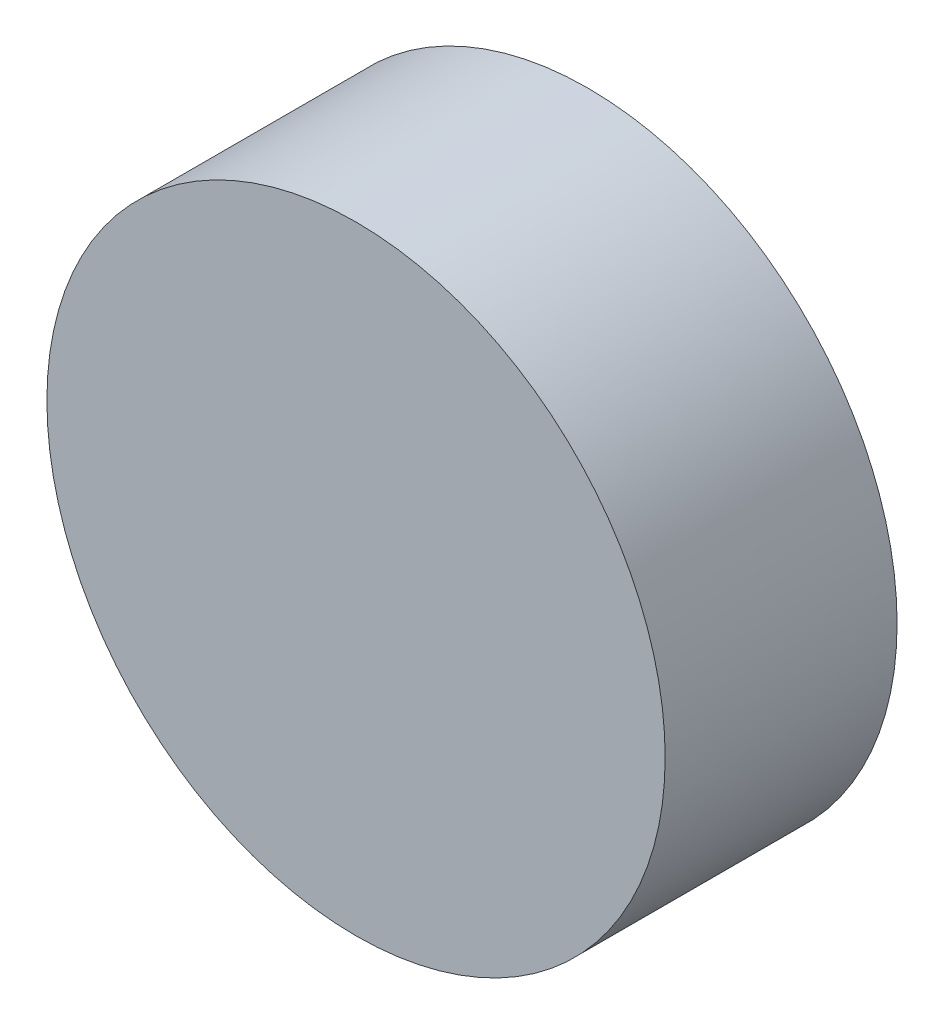
ISO-10303-21;
HEADER;
FILE_DESCRIPTION(('STEP AP214'),'2;1');
FILE_NAME('part.step','',(''),(''),'','','');
FILE_SCHEMA(('AUTOMOTIVE_DESIGN { 1 0 10303 214 1 1 1 1 }'));
ENDSEC;
DATA;
#1=APPLICATION_CONTEXT('core data for automotive mechanical design processes');
#2=APPLICATION_PROTOCOL_DEFINITION('international standard','automotive_design',2000,#1);
#3=PRODUCT_CONTEXT('',#1,'mechanical');
#4=PRODUCT('Part','Part','',(#3));
#5=PRODUCT_RELATED_PRODUCT_CATEGORY('part','',(#4));
#6=PRODUCT_DEFINITION_FORMATION('','',#4);
#7=PRODUCT_DEFINITION_CONTEXT('part definition',#1,'design');
#8=PRODUCT_DEFINITION('design','',#6,#7);
#9=PRODUCT_DEFINITION_SHAPE('','',#8);
#10=(LENGTH_UNIT() NAMED_UNIT(*) SI_UNIT(.MILLI.,.METRE.));
#11=(NAMED_UNIT(*) PLANE_ANGLE_UNIT() SI_UNIT($,.RADIAN.));
#12=(NAMED_UNIT(*) SI_UNIT($,.STERADIAN.) SOLID_ANGLE_UNIT());
#13=UNCERTAINTY_MEASURE_WITH_UNIT(LENGTH_MEASURE(1.E-05),#10,'distance_accuracy_value','');
#14=(GEOMETRIC_REPRESENTATION_CONTEXT(3) GLOBAL_UNCERTAINTY_ASSIGNED_CONTEXT((#13)) GLOBAL_UNIT_ASSIGNED_CONTEXT((#10,
#11,#12)) REPRESENTATION_CONTEXT('',''));
#15=CARTESIAN_POINT('',(0.,0.,0.));
#16=DIRECTION('',(0.,0.,1.));
#17=DIRECTION('',(1.,0.,0.));
#18=AXIS2_PLACEMENT_3D('',#15,#16,#17);
#19=CARTESIAN_POINT('',(0.,0.,32.1183445097694));
#20=DIRECTION('',(0.,0.,1.));
#21=DIRECTION('',(1.,0.,0.));
#22=AXIS2_PLACEMENT_3D('',#19,#20,#21);
#23=SPHERICAL_SURFACE('',#22,35.1752487);
#24=CARTESIAN_POINT('',(0.,0.,-2.85104383356386));
#25=DIRECTION('',(0.,0.,1.));
#26=DIRECTION('',(1.,0.,0.));
#27=AXIS2_PLACEMENT_3D('',#24,#25,#26);
#28=CIRCLE('',#27,3.79999999999999);
#29=CARTESIAN_POINT('',(3.79999999999999,0.,-2.85104383356386));
#30=VERTEX_POINT('',#29);
#31=EDGE_CURVE('E10',#30,#30,#28,.F.);
#32=ORIENTED_EDGE('',*,*,#31,.T.);
#33=EDGE_LOOP('',(#32));
#34=FACE_BOUND('',#33,.T.);
#35=ADVANCED_FACE('F31',(#34),#23,.T.);
#36=CARTESIAN_POINT('',(0.,0.,-3.0569041902306));
#37=DIRECTION('',(0.,0.,1.));
#38=DIRECTION('',(1.,0.,0.));
#39=AXIS2_PLACEMENT_3D('',#36,#37,#38);
#40=CYLINDRICAL_SURFACE('',#39,3.79999999999999);
#41=ORIENTED_EDGE('',*,*,#31,.F.);
#42=EDGE_LOOP('',(#41));
#43=FACE_BOUND('',#42,.T.);
#44=CARTESIAN_POINT('',(0.,0.,0.));
#45=DIRECTION('',(0.,0.,1.));
#46=DIRECTION('',(1.,0.,0.));
#47=AXIS2_PLACEMENT_3D('',#44,#45,#46);
#48=CIRCLE('',#47,3.79999999999999);
#49=CARTESIAN_POINT('',(3.79999999999999,0.,0.));
#50=VERTEX_POINT('',#49);
#51=EDGE_CURVE('E38',#50,#50,#48,.T.);
#52=ORIENTED_EDGE('',*,*,#51,.F.);
#53=EDGE_LOOP('',(#52));
#54=FACE_BOUND('',#53,.T.);
#55=ADVANCED_FACE('F45',(#43,#54),#40,.T.);
#56=CARTESIAN_POINT('',(3.99999999999999,0.,0.));
#57=DIRECTION('',(0.,0.,1.));
#58=DIRECTION('',(1.,0.,0.));
#59=AXIS2_PLACEMENT_3D('',#56,#57,#58);
#60=PLANE('',#59);
#61=ORIENTED_EDGE('',*,*,#51,.T.);
#62=EDGE_LOOP('',(#61));
#63=FACE_BOUND('',#62,.T.);
#64=ADVANCED_FACE('F33',(#63),#60,.T.);
#65=CLOSED_SHELL('',(#35,#55,#64));
#66=MANIFOLD_SOLID_BREP('B2',#65);
#67=ADVANCED_BREP_SHAPE_REPRESENTATION('',(#18,#66),#14);
#68=SHAPE_DEFINITION_REPRESENTATION(#9,#67);
ENDSEC;
END-ISO-10303-21;
